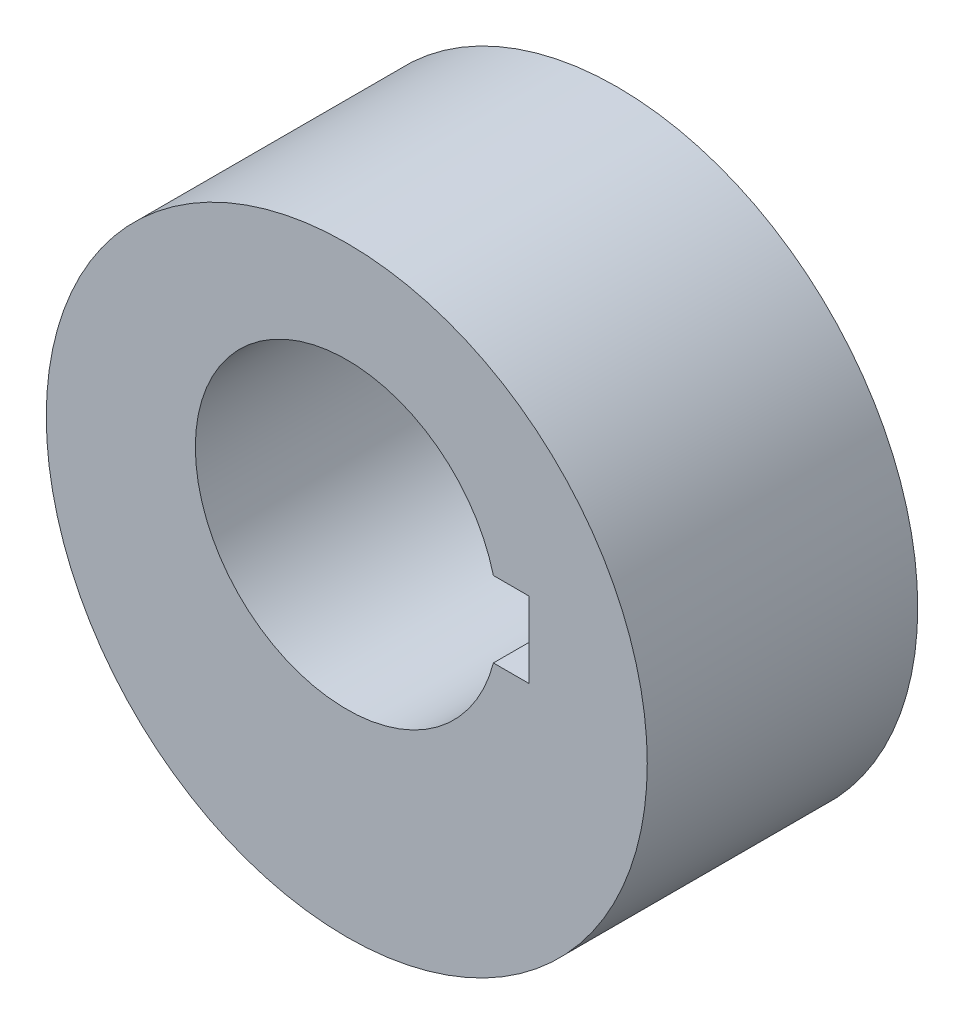
ISO-10303-21;
HEADER;
FILE_DESCRIPTION(('STEP AP214'),'2;1');
FILE_NAME('part.step','',(''),(''),'','','');
FILE_SCHEMA(('AUTOMOTIVE_DESIGN { 1 0 10303 214 1 1 1 1 }'));
ENDSEC;
DATA;
#1=APPLICATION_CONTEXT('core data for automotive mechanical design processes');
#2=APPLICATION_PROTOCOL_DEFINITION('international standard','automotive_design',2000,#1);
#3=PRODUCT_CONTEXT('',#1,'mechanical');
#4=PRODUCT('Part','Part','',(#3));
#5=PRODUCT_RELATED_PRODUCT_CATEGORY('part','',(#4));
#6=PRODUCT_DEFINITION_FORMATION('','',#4);
#7=PRODUCT_DEFINITION_CONTEXT('part definition',#1,'design');
#8=PRODUCT_DEFINITION('design','',#6,#7);
#9=PRODUCT_DEFINITION_SHAPE('','',#8);
#10=(LENGTH_UNIT() NAMED_UNIT(*) SI_UNIT(.MILLI.,.METRE.));
#11=(NAMED_UNIT(*) PLANE_ANGLE_UNIT() SI_UNIT($,.RADIAN.));
#12=(NAMED_UNIT(*) SI_UNIT($,.STERADIAN.) SOLID_ANGLE_UNIT());
#13=UNCERTAINTY_MEASURE_WITH_UNIT(LENGTH_MEASURE(1.E-05),#10,'distance_accuracy_value','');
#14=(GEOMETRIC_REPRESENTATION_CONTEXT(3) GLOBAL_UNCERTAINTY_ASSIGNED_CONTEXT((#13)) GLOBAL_UNIT_ASSIGNED_CONTEXT((#10,
#11,#12)) REPRESENTATION_CONTEXT('',''));
#15=CARTESIAN_POINT('',(0.,0.,0.));
#16=DIRECTION('',(0.,0.,1.));
#17=DIRECTION('',(1.,0.,0.));
#18=AXIS2_PLACEMENT_3D('',#15,#16,#17);
#19=CARTESIAN_POINT('',(0.,0.,7.14375));
#20=DIRECTION('',(0.,0.,1.));
#21=DIRECTION('',(1.,0.,0.));
#22=AXIS2_PLACEMENT_3D('',#19,#20,#21);
#23=PLANE('',#22);
#24=DIRECTION('',(-1.,0.,0.));
#25=VECTOR('',#24,1.);
#26=CARTESIAN_POINT('',(4.,0.269999999999999,7.14375));
#27=LINE('',#26,#25);
#28=CARTESIAN_POINT('',(4.809500032,0.269999999999999,7.14375));
#29=VERTEX_POINT('',#28);
#30=CARTESIAN_POINT('',(3.87298334620742,0.269999999999999,7.14375));
#31=VERTEX_POINT('',#30);
#32=EDGE_CURVE('E67',#29,#31,#27,.T.);
#33=ORIENTED_EDGE('',*,*,#32,.T.);
#34=CARTESIAN_POINT('',(0.,1.27,7.14375));
#35=DIRECTION('',(0.,0.,1.));
#36=DIRECTION('',(1.,0.,0.));
#37=AXIS2_PLACEMENT_3D('',#34,#35,#36);
#38=CIRCLE('',#37,4.);
#39=CARTESIAN_POINT('',(3.87298334620742,2.27,7.14375));
#40=VERTEX_POINT('',#39);
#41=EDGE_CURVE('E106',#40,#31,#38,.T.);
#42=ORIENTED_EDGE('',*,*,#41,.F.);
#43=DIRECTION('',(1.,0.,0.));
#44=VECTOR('',#43,1.);
#45=CARTESIAN_POINT('',(4.,2.27,7.14375));
#46=LINE('',#45,#44);
#47=CARTESIAN_POINT('',(4.809500032,2.27,7.14375));
#48=VERTEX_POINT('',#47);
#49=EDGE_CURVE('E88',#40,#48,#46,.T.);
#50=ORIENTED_EDGE('',*,*,#49,.T.);
#51=DIRECTION('',(0.,-1.,0.));
#52=VECTOR('',#51,1.);
#53=CARTESIAN_POINT('',(4.809500032,0.269999999999999,7.14375));
#54=LINE('',#53,#52);
#55=EDGE_CURVE('E100',#48,#29,#54,.T.);
#56=ORIENTED_EDGE('',*,*,#55,.T.);
#57=EDGE_LOOP('',(#33,#42,#50,#56));
#58=FACE_BOUND('',#57,.T.);
#59=CARTESIAN_POINT('',(0.,0.,7.14375));
#60=DIRECTION('',(0.,0.,1.));
#61=DIRECTION('',(1.,0.,0.));
#62=AXIS2_PLACEMENT_3D('',#59,#60,#61);
#63=CIRCLE('',#62,7.9375);
#64=CARTESIAN_POINT('',(7.9375,0.,7.14375));
#65=VERTEX_POINT('',#64);
#66=EDGE_CURVE('E11',#65,#65,#63,.T.);
#67=ORIENTED_EDGE('',*,*,#66,.T.);
#68=EDGE_LOOP('',(#67));
#69=FACE_BOUND('',#68,.T.);
#70=ADVANCED_FACE('F45',(#58,#69),#23,.T.);
#71=CARTESIAN_POINT('',(0.,0.,0.));
#72=DIRECTION('',(0.,0.,1.));
#73=DIRECTION('',(1.,0.,0.));
#74=AXIS2_PLACEMENT_3D('',#71,#72,#73);
#75=PLANE('',#74);
#76=CARTESIAN_POINT('',(0.,0.,0.));
#77=DIRECTION('',(0.,0.,1.));
#78=DIRECTION('',(1.,0.,0.));
#79=AXIS2_PLACEMENT_3D('',#76,#77,#78);
#80=CIRCLE('',#79,7.9375);
#81=CARTESIAN_POINT('',(7.9375,0.,0.));
#82=VERTEX_POINT('',#81);
#83=EDGE_CURVE('E49',#82,#82,#80,.T.);
#84=ORIENTED_EDGE('',*,*,#83,.F.);
#85=EDGE_LOOP('',(#84));
#86=FACE_BOUND('',#85,.T.);
#87=CARTESIAN_POINT('',(0.,1.27,0.));
#88=DIRECTION('',(0.,0.,1.));
#89=DIRECTION('',(1.,0.,0.));
#90=AXIS2_PLACEMENT_3D('',#87,#88,#89);
#91=CIRCLE('',#90,4.);
#92=CARTESIAN_POINT('',(3.87298334620742,2.27,0.));
#93=VERTEX_POINT('',#92);
#94=CARTESIAN_POINT('',(3.87298334620742,0.270000000000001,0.));
#95=VERTEX_POINT('',#94);
#96=EDGE_CURVE('E108',#93,#95,#91,.T.);
#97=ORIENTED_EDGE('',*,*,#96,.T.);
#98=DIRECTION('',(-1.,0.,0.));
#99=VECTOR('',#98,1.);
#100=CARTESIAN_POINT('',(4.,0.269999999999999,0.));
#101=LINE('',#100,#99);
#102=CARTESIAN_POINT('',(4.809500032,0.269999999999999,0.));
#103=VERTEX_POINT('',#102);
#104=EDGE_CURVE('E61',#103,#95,#101,.T.);
#105=ORIENTED_EDGE('',*,*,#104,.F.);
#106=DIRECTION('',(0.,-1.,0.));
#107=VECTOR('',#106,1.);
#108=CARTESIAN_POINT('',(4.809500032,0.269999999999999,0.));
#109=LINE('',#108,#107);
#110=CARTESIAN_POINT('',(4.809500032,2.27,0.));
#111=VERTEX_POINT('',#110);
#112=EDGE_CURVE('E127',#111,#103,#109,.T.);
#113=ORIENTED_EDGE('',*,*,#112,.F.);
#114=DIRECTION('',(1.,0.,0.));
#115=VECTOR('',#114,1.);
#116=CARTESIAN_POINT('',(4.809500032,2.27,0.));
#117=LINE('',#116,#115);
#118=EDGE_CURVE('E130',#93,#111,#117,.T.);
#119=ORIENTED_EDGE('',*,*,#118,.F.);
#120=EDGE_LOOP('',(#97,#105,#113,#119));
#121=FACE_BOUND('',#120,.T.);
#122=ADVANCED_FACE('F140',(#86,#121),#75,.F.);
#123=CARTESIAN_POINT('',(0.,0.,7.14375));
#124=DIRECTION('',(0.,0.,-1.));
#125=DIRECTION('',(-1.,0.,0.));
#126=AXIS2_PLACEMENT_3D('',#123,#124,#125);
#127=CYLINDRICAL_SURFACE('',#126,7.9375);
#128=ORIENTED_EDGE('',*,*,#66,.F.);
#129=EDGE_LOOP('',(#128));
#130=FACE_BOUND('',#129,.T.);
#131=ORIENTED_EDGE('',*,*,#83,.T.);
#132=EDGE_LOOP('',(#131));
#133=FACE_BOUND('',#132,.T.);
#134=ADVANCED_FACE('F47',(#130,#133),#127,.T.);
#135=CARTESIAN_POINT('',(0.,1.27,7.14375));
#136=DIRECTION('',(0.,0.,-1.));
#137=DIRECTION('',(-1.,0.,0.));
#138=AXIS2_PLACEMENT_3D('',#135,#136,#137);
#139=CYLINDRICAL_SURFACE('',#138,4.);
#140=DIRECTION('',(0.,0.,-1.));
#141=VECTOR('',#140,1.);
#142=CARTESIAN_POINT('',(3.87298334620742,2.27,7.14375));
#143=LINE('',#142,#141);
#144=EDGE_CURVE('E92',#40,#93,#143,.T.);
#145=ORIENTED_EDGE('',*,*,#144,.F.);
#146=ORIENTED_EDGE('',*,*,#41,.T.);
#147=DIRECTION('',(0.,0.,-1.));
#148=VECTOR('',#147,1.);
#149=CARTESIAN_POINT('',(3.87298334620742,0.269999999999999,7.14375));
#150=LINE('',#149,#148);
#151=EDGE_CURVE('E84',#31,#95,#150,.T.);
#152=ORIENTED_EDGE('',*,*,#151,.T.);
#153=ORIENTED_EDGE('',*,*,#96,.F.);
#154=EDGE_LOOP('',(#145,#146,#152,#153));
#155=FACE_BOUND('',#154,.T.);
#156=ADVANCED_FACE('F105',(#155),#139,.F.);
#157=CARTESIAN_POINT('',(4.,0.269999999999999,7.14375));
#158=DIRECTION('',(0.,-1.,0.));
#159=DIRECTION('',(1.,0.,0.));
#160=AXIS2_PLACEMENT_3D('',#157,#158,#159);
#161=PLANE('',#160);
#162=ORIENTED_EDGE('',*,*,#104,.T.);
#163=ORIENTED_EDGE('',*,*,#151,.F.);
#164=ORIENTED_EDGE('',*,*,#32,.F.);
#165=DIRECTION('',(0.,0.,-1.));
#166=VECTOR('',#165,1.);
#167=CARTESIAN_POINT('',(4.809500032,0.269999999999999,7.14375));
#168=LINE('',#167,#166);
#169=EDGE_CURVE('E81',#29,#103,#168,.T.);
#170=ORIENTED_EDGE('',*,*,#169,.T.);
#171=EDGE_LOOP('',(#162,#163,#164,#170));
#172=FACE_BOUND('',#171,.T.);
#173=ADVANCED_FACE('F153',(#172),#161,.F.);
#174=CARTESIAN_POINT('',(4.809500032,0.269999999999999,7.14375));
#175=DIRECTION('',(1.,0.,0.));
#176=DIRECTION('',(0.,0.,-1.));
#177=AXIS2_PLACEMENT_3D('',#174,#175,#176);
#178=PLANE('',#177);
#179=ORIENTED_EDGE('',*,*,#112,.T.);
#180=ORIENTED_EDGE('',*,*,#169,.F.);
#181=ORIENTED_EDGE('',*,*,#55,.F.);
#182=DIRECTION('',(0.,0.,-1.));
#183=VECTOR('',#182,1.);
#184=CARTESIAN_POINT('',(4.809500032,2.27,7.14375));
#185=LINE('',#184,#183);
#186=EDGE_CURVE('E94',#48,#111,#185,.T.);
#187=ORIENTED_EDGE('',*,*,#186,.T.);
#188=EDGE_LOOP('',(#179,#180,#181,#187));
#189=FACE_BOUND('',#188,.T.);
#190=ADVANCED_FACE('F137',(#189),#178,.F.);
#191=CARTESIAN_POINT('',(4.809500032,2.27,7.14375));
#192=DIRECTION('',(0.,1.,0.));
#193=DIRECTION('',(0.,0.,1.));
#194=AXIS2_PLACEMENT_3D('',#191,#192,#193);
#195=PLANE('',#194);
#196=ORIENTED_EDGE('',*,*,#118,.T.);
#197=ORIENTED_EDGE('',*,*,#186,.F.);
#198=ORIENTED_EDGE('',*,*,#49,.F.);
#199=ORIENTED_EDGE('',*,*,#144,.T.);
#200=EDGE_LOOP('',(#196,#197,#198,#199));
#201=FACE_BOUND('',#200,.T.);
#202=ADVANCED_FACE('F91',(#201),#195,.F.);
#203=CLOSED_SHELL('',(#70,#122,#134,#156,#173,#190,#202));
#204=MANIFOLD_SOLID_BREP('B2',#203);
#205=ADVANCED_BREP_SHAPE_REPRESENTATION('',(#18,#204),#14);
#206=SHAPE_DEFINITION_REPRESENTATION(#9,#205);
ENDSEC;
END-ISO-10303-21;
